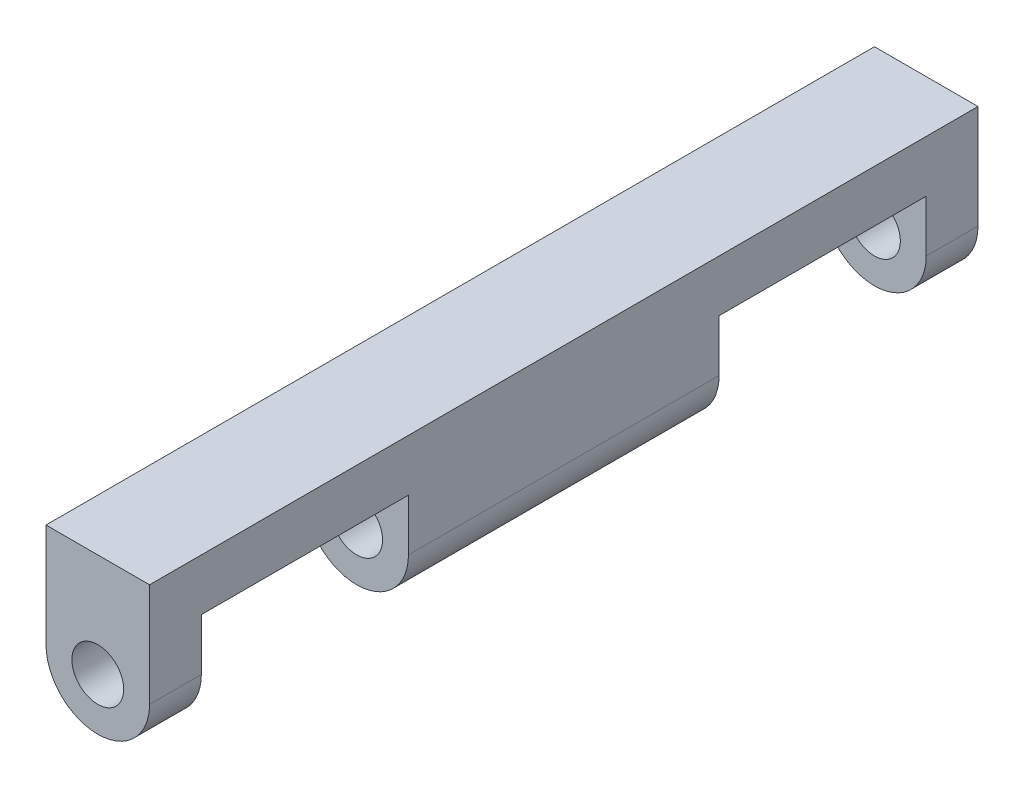
ISO-10303-21;
HEADER;
FILE_DESCRIPTION(('STEP AP214'),'2;1');
FILE_NAME('part.step','',(''),(''),'','','');
FILE_SCHEMA(('AUTOMOTIVE_DESIGN { 1 0 10303 214 1 1 1 1 }'));
ENDSEC;
DATA;
#1=APPLICATION_CONTEXT('core data for automotive mechanical design processes');
#2=APPLICATION_PROTOCOL_DEFINITION('international standard','automotive_design',2000,#1);
#3=PRODUCT_CONTEXT('',#1,'mechanical');
#4=PRODUCT('Part','Part','',(#3));
#5=PRODUCT_RELATED_PRODUCT_CATEGORY('part','',(#4));
#6=PRODUCT_DEFINITION_FORMATION('','',#4);
#7=PRODUCT_DEFINITION_CONTEXT('part definition',#1,'design');
#8=PRODUCT_DEFINITION('design','',#6,#7);
#9=PRODUCT_DEFINITION_SHAPE('','',#8);
#10=(LENGTH_UNIT() NAMED_UNIT(*) SI_UNIT(.MILLI.,.METRE.));
#11=(NAMED_UNIT(*) PLANE_ANGLE_UNIT() SI_UNIT($,.RADIAN.));
#12=(NAMED_UNIT(*) SI_UNIT($,.STERADIAN.) SOLID_ANGLE_UNIT());
#13=UNCERTAINTY_MEASURE_WITH_UNIT(LENGTH_MEASURE(1.E-05),#10,'distance_accuracy_value','');
#14=(GEOMETRIC_REPRESENTATION_CONTEXT(3) GLOBAL_UNCERTAINTY_ASSIGNED_CONTEXT((#13)) GLOBAL_UNIT_ASSIGNED_CONTEXT((#10,
#11,#12)) REPRESENTATION_CONTEXT('',''));
#15=CARTESIAN_POINT('',(0.,0.,0.));
#16=DIRECTION('',(0.,0.,1.));
#17=DIRECTION('',(1.,0.,0.));
#18=AXIS2_PLACEMENT_3D('',#15,#16,#17);
#19=CARTESIAN_POINT('',(0.,0.,80.));
#20=DIRECTION('',(0.,0.,-1.));
#21=DIRECTION('',(-1.,0.,0.));
#22=AXIS2_PLACEMENT_3D('',#19,#20,#21);
#23=CYLINDRICAL_SURFACE('',#22,5.);
#24=DIRECTION('',(0.,0.,-1.));
#25=VECTOR('',#24,1.);
#26=CARTESIAN_POINT('',(-5.,0.,80.));
#27=LINE('',#26,#25);
#28=CARTESIAN_POINT('',(-5.,0.,55.));
#29=VERTEX_POINT('',#28);
#30=CARTESIAN_POINT('',(-5.,0.,25.));
#31=VERTEX_POINT('',#30);
#32=EDGE_CURVE('E215',#29,#31,#27,.T.);
#33=ORIENTED_EDGE('',*,*,#32,.T.);
#34=CARTESIAN_POINT('',(0.,0.,25.));
#35=DIRECTION('',(0.,0.,1.));
#36=DIRECTION('',(0.,-1.,0.));
#37=AXIS2_PLACEMENT_3D('',#34,#35,#36);
#38=CIRCLE('',#37,5.);
#39=CARTESIAN_POINT('',(5.,0.,25.));
#40=VERTEX_POINT('',#39);
#41=EDGE_CURVE('E173',#31,#40,#38,.T.);
#42=ORIENTED_EDGE('',*,*,#41,.T.);
#43=DIRECTION('',(0.,0.,-1.));
#44=VECTOR('',#43,1.);
#45=CARTESIAN_POINT('',(5.,0.,80.));
#46=LINE('',#45,#44);
#47=CARTESIAN_POINT('',(5.,0.,55.));
#48=VERTEX_POINT('',#47);
#49=EDGE_CURVE('E210',#48,#40,#46,.T.);
#50=ORIENTED_EDGE('',*,*,#49,.F.);
#51=CARTESIAN_POINT('',(0.,0.,55.));
#52=DIRECTION('',(0.,0.,-1.));
#53=DIRECTION('',(-1.,0.,0.));
#54=AXIS2_PLACEMENT_3D('',#51,#52,#53);
#55=CIRCLE('',#54,5.);
#56=EDGE_CURVE('E159',#48,#29,#55,.T.);
#57=ORIENTED_EDGE('',*,*,#56,.T.);
#58=EDGE_LOOP('',(#33,#42,#50,#57));
#59=FACE_BOUND('',#58,.T.);
#60=ADVANCED_FACE('F34',(#59),#23,.T.);
#61=CARTESIAN_POINT('',(-5.,0.,80.));
#62=VERTEX_POINT('',#61);
#63=CARTESIAN_POINT('',(-5.,0.,75.));
#64=VERTEX_POINT('',#63);
#65=EDGE_CURVE('E211',#62,#64,#27,.T.);
#66=ORIENTED_EDGE('',*,*,#65,.T.);
#67=CARTESIAN_POINT('',(0.,0.,75.));
#68=DIRECTION('',(0.,0.,1.));
#69=DIRECTION('',(1.,0.,0.));
#70=AXIS2_PLACEMENT_3D('',#67,#68,#69);
#71=CIRCLE('',#70,5.);
#72=CARTESIAN_POINT('',(5.,0.,75.));
#73=VERTEX_POINT('',#72);
#74=EDGE_CURVE('E163',#64,#73,#71,.T.);
#75=ORIENTED_EDGE('',*,*,#74,.T.);
#76=CARTESIAN_POINT('',(5.,0.,80.));
#77=VERTEX_POINT('',#76);
#78=EDGE_CURVE('E206',#77,#73,#46,.T.);
#79=ORIENTED_EDGE('',*,*,#78,.F.);
#80=CARTESIAN_POINT('',(0.,0.,80.));
#81=DIRECTION('',(0.,0.,1.));
#82=DIRECTION('',(1.,0.,0.));
#83=AXIS2_PLACEMENT_3D('',#80,#81,#82);
#84=CIRCLE('',#83,5.);
#85=EDGE_CURVE('E194',#62,#77,#84,.T.);
#86=ORIENTED_EDGE('',*,*,#85,.F.);
#87=EDGE_LOOP('',(#66,#75,#79,#86));
#88=FACE_BOUND('',#87,.T.);
#89=ADVANCED_FACE('F246',(#88),#23,.T.);
#90=CARTESIAN_POINT('',(0.,0.,80.));
#91=DIRECTION('',(0.,0.,-1.));
#92=DIRECTION('',(-1.,0.,0.));
#93=AXIS2_PLACEMENT_3D('',#90,#91,#92);
#94=CYLINDRICAL_SURFACE('',#93,2.5);
#95=CARTESIAN_POINT('',(0.,0.,75.));
#96=DIRECTION('',(0.,0.,1.));
#97=DIRECTION('',(1.,0.,0.));
#98=AXIS2_PLACEMENT_3D('',#95,#96,#97);
#99=CIRCLE('',#98,2.5);
#100=CARTESIAN_POINT('',(2.5,0.,75.));
#101=VERTEX_POINT('',#100);
#102=EDGE_CURVE('E162',#101,#101,#99,.T.);
#103=ORIENTED_EDGE('',*,*,#102,.F.);
#104=EDGE_LOOP('',(#103));
#105=FACE_BOUND('',#104,.T.);
#106=CARTESIAN_POINT('',(0.,0.,80.));
#107=DIRECTION('',(0.,0.,1.));
#108=DIRECTION('',(1.,0.,0.));
#109=AXIS2_PLACEMENT_3D('',#106,#107,#108);
#110=CIRCLE('',#109,2.5);
#111=CARTESIAN_POINT('',(2.5,0.,80.));
#112=VERTEX_POINT('',#111);
#113=EDGE_CURVE('E180',#112,#112,#110,.T.);
#114=ORIENTED_EDGE('',*,*,#113,.T.);
#115=EDGE_LOOP('',(#114));
#116=FACE_BOUND('',#115,.T.);
#117=ADVANCED_FACE('F286',(#105,#116),#94,.F.);
#118=CARTESIAN_POINT('',(0.,0.,80.));
#119=DIRECTION('',(0.,0.,1.));
#120=DIRECTION('',(1.,0.,0.));
#121=AXIS2_PLACEMENT_3D('',#118,#119,#120);
#122=PLANE('',#121);
#123=DIRECTION('',(0.,1.,0.));
#124=VECTOR('',#123,1.);
#125=CARTESIAN_POINT('',(5.,10.,80.));
#126=LINE('',#125,#124);
#127=CARTESIAN_POINT('',(5.,10.,80.));
#128=VERTEX_POINT('',#127);
#129=EDGE_CURVE('E186',#77,#128,#126,.T.);
#130=ORIENTED_EDGE('',*,*,#129,.T.);
#131=DIRECTION('',(-1.,0.,0.));
#132=VECTOR('',#131,1.);
#133=CARTESIAN_POINT('',(-5.,10.,80.));
#134=LINE('',#133,#132);
#135=CARTESIAN_POINT('',(-5.,10.,80.));
#136=VERTEX_POINT('',#135);
#137=EDGE_CURVE('E189',#128,#136,#134,.T.);
#138=ORIENTED_EDGE('',*,*,#137,.T.);
#139=DIRECTION('',(0.,-1.,0.));
#140=VECTOR('',#139,1.);
#141=CARTESIAN_POINT('',(-5.,10.,80.));
#142=LINE('',#141,#140);
#143=EDGE_CURVE('E192',#136,#62,#142,.T.);
#144=ORIENTED_EDGE('',*,*,#143,.T.);
#145=ORIENTED_EDGE('',*,*,#85,.T.);
#146=EDGE_LOOP('',(#130,#138,#144,#145));
#147=FACE_BOUND('',#146,.T.);
#148=ORIENTED_EDGE('',*,*,#113,.F.);
#149=EDGE_LOOP('',(#148));
#150=FACE_BOUND('',#149,.T.);
#151=ADVANCED_FACE('F252',(#147,#150),#122,.T.);
#152=CARTESIAN_POINT('',(0.,0.,0.));
#153=DIRECTION('',(0.,0.,1.));
#154=DIRECTION('',(1.,0.,0.));
#155=AXIS2_PLACEMENT_3D('',#152,#153,#154);
#156=PLANE('',#155);
#157=DIRECTION('',(0.,1.,0.));
#158=VECTOR('',#157,1.);
#159=CARTESIAN_POINT('',(5.,10.,0.));
#160=LINE('',#159,#158);
#161=CARTESIAN_POINT('',(5.,0.,0.));
#162=VERTEX_POINT('',#161);
#163=CARTESIAN_POINT('',(5.,10.,0.));
#164=VERTEX_POINT('',#163);
#165=EDGE_CURVE('E183',#162,#164,#160,.T.);
#166=ORIENTED_EDGE('',*,*,#165,.F.);
#167=CARTESIAN_POINT('',(0.,0.,0.));
#168=DIRECTION('',(0.,0.,1.));
#169=DIRECTION('',(1.,0.,0.));
#170=AXIS2_PLACEMENT_3D('',#167,#168,#169);
#171=CIRCLE('',#170,5.);
#172=CARTESIAN_POINT('',(-5.,0.,0.));
#173=VERTEX_POINT('',#172);
#174=EDGE_CURVE('E190',#173,#162,#171,.T.);
#175=ORIENTED_EDGE('',*,*,#174,.F.);
#176=DIRECTION('',(0.,-1.,0.));
#177=VECTOR('',#176,1.);
#178=CARTESIAN_POINT('',(-5.,10.,0.));
#179=LINE('',#178,#177);
#180=CARTESIAN_POINT('',(-5.,10.,0.));
#181=VERTEX_POINT('',#180);
#182=EDGE_CURVE('E201',#181,#173,#179,.T.);
#183=ORIENTED_EDGE('',*,*,#182,.F.);
#184=DIRECTION('',(-1.,0.,0.));
#185=VECTOR('',#184,1.);
#186=CARTESIAN_POINT('',(-5.,10.,0.));
#187=LINE('',#186,#185);
#188=EDGE_CURVE('E199',#164,#181,#187,.T.);
#189=ORIENTED_EDGE('',*,*,#188,.F.);
#190=EDGE_LOOP('',(#166,#175,#183,#189));
#191=FACE_BOUND('',#190,.T.);
#192=CARTESIAN_POINT('',(0.,0.,0.));
#193=DIRECTION('',(0.,0.,1.));
#194=DIRECTION('',(1.,0.,0.));
#195=AXIS2_PLACEMENT_3D('',#192,#193,#194);
#196=CIRCLE('',#195,2.5);
#197=CARTESIAN_POINT('',(2.5,0.,0.));
#198=VERTEX_POINT('',#197);
#199=EDGE_CURVE('E179',#198,#198,#196,.T.);
#200=ORIENTED_EDGE('',*,*,#199,.T.);
#201=EDGE_LOOP('',(#200));
#202=FACE_BOUND('',#201,.T.);
#203=ADVANCED_FACE('F259',(#191,#202),#156,.F.);
#204=CARTESIAN_POINT('',(5.,10.,80.));
#205=DIRECTION('',(-1.,0.,0.));
#206=DIRECTION('',(0.,-1.,0.));
#207=AXIS2_PLACEMENT_3D('',#204,#205,#206);
#208=PLANE('',#207);
#209=ORIENTED_EDGE('',*,*,#49,.T.);
#210=DIRECTION('',(0.,-1.,0.));
#211=VECTOR('',#210,1.);
#212=CARTESIAN_POINT('',(5.,5.,25.));
#213=LINE('',#212,#211);
#214=CARTESIAN_POINT('',(5.,5.,25.));
#215=VERTEX_POINT('',#214);
#216=EDGE_CURVE('E139',#215,#40,#213,.T.);
#217=ORIENTED_EDGE('',*,*,#216,.F.);
#218=DIRECTION('',(0.,0.,1.));
#219=VECTOR('',#218,1.);
#220=CARTESIAN_POINT('',(5.,5.,25.));
#221=LINE('',#220,#219);
#222=CARTESIAN_POINT('',(5.,5.,5.));
#223=VERTEX_POINT('',#222);
#224=EDGE_CURVE('E129',#223,#215,#221,.T.);
#225=ORIENTED_EDGE('',*,*,#224,.F.);
#226=DIRECTION('',(0.,1.,0.));
#227=VECTOR('',#226,1.);
#228=CARTESIAN_POINT('',(5.,5.,5.));
#229=LINE('',#228,#227);
#230=CARTESIAN_POINT('',(5.,0.,5.));
#231=VERTEX_POINT('',#230);
#232=EDGE_CURVE('E134',#231,#223,#229,.T.);
#233=ORIENTED_EDGE('',*,*,#232,.F.);
#234=EDGE_CURVE('E196',#231,#162,#46,.T.);
#235=ORIENTED_EDGE('',*,*,#234,.T.);
#236=ORIENTED_EDGE('',*,*,#165,.T.);
#237=DIRECTION('',(0.,0.,-1.));
#238=VECTOR('',#237,1.);
#239=CARTESIAN_POINT('',(5.,10.,80.));
#240=LINE('',#239,#238);
#241=EDGE_CURVE('E218',#128,#164,#240,.T.);
#242=ORIENTED_EDGE('',*,*,#241,.F.);
#243=ORIENTED_EDGE('',*,*,#129,.F.);
#244=ORIENTED_EDGE('',*,*,#78,.T.);
#245=DIRECTION('',(0.,-1.,0.));
#246=VECTOR('',#245,1.);
#247=CARTESIAN_POINT('',(5.,5.,75.));
#248=LINE('',#247,#246);
#249=CARTESIAN_POINT('',(5.,5.,75.));
#250=VERTEX_POINT('',#249);
#251=EDGE_CURVE('E147',#250,#73,#248,.T.);
#252=ORIENTED_EDGE('',*,*,#251,.F.);
#253=DIRECTION('',(0.,0.,1.));
#254=VECTOR('',#253,1.);
#255=CARTESIAN_POINT('',(5.,5.,75.));
#256=LINE('',#255,#254);
#257=CARTESIAN_POINT('',(5.,5.,55.));
#258=VERTEX_POINT('',#257);
#259=EDGE_CURVE('E152',#258,#250,#256,.T.);
#260=ORIENTED_EDGE('',*,*,#259,.F.);
#261=DIRECTION('',(0.,1.,0.));
#262=VECTOR('',#261,1.);
#263=CARTESIAN_POINT('',(5.,5.,55.));
#264=LINE('',#263,#262);
#265=EDGE_CURVE('E149',#48,#258,#264,.T.);
#266=ORIENTED_EDGE('',*,*,#265,.F.);
#267=EDGE_LOOP('',(#209,#217,#225,#233,#235,#236,#242,#243,#244,#252,#260,#266));
#268=FACE_BOUND('',#267,.T.);
#269=ADVANCED_FACE('F36',(#268),#208,.F.);
#270=CARTESIAN_POINT('',(-5.,10.,80.));
#271=DIRECTION('',(0.,-1.,0.));
#272=DIRECTION('',(0.,0.,-1.));
#273=AXIS2_PLACEMENT_3D('',#270,#271,#272);
#274=PLANE('',#273);
#275=ORIENTED_EDGE('',*,*,#188,.T.);
#276=DIRECTION('',(0.,0.,-1.));
#277=VECTOR('',#276,1.);
#278=CARTESIAN_POINT('',(-5.,10.,80.));
#279=LINE('',#278,#277);
#280=EDGE_CURVE('E214',#136,#181,#279,.T.);
#281=ORIENTED_EDGE('',*,*,#280,.F.);
#282=ORIENTED_EDGE('',*,*,#137,.F.);
#283=ORIENTED_EDGE('',*,*,#241,.T.);
#284=EDGE_LOOP('',(#275,#281,#282,#283));
#285=FACE_BOUND('',#284,.T.);
#286=ADVANCED_FACE('F256',(#285),#274,.F.);
#287=CARTESIAN_POINT('',(-5.,10.,80.));
#288=DIRECTION('',(1.,0.,0.));
#289=DIRECTION('',(0.,1.,0.));
#290=AXIS2_PLACEMENT_3D('',#287,#288,#289);
#291=PLANE('',#290);
#292=DIRECTION('',(0.,0.,1.));
#293=VECTOR('',#292,1.);
#294=CARTESIAN_POINT('',(-5.,5.,80.));
#295=LINE('',#294,#293);
#296=CARTESIAN_POINT('',(-5.,5.,5.));
#297=VERTEX_POINT('',#296);
#298=CARTESIAN_POINT('',(-5.,5.,25.));
#299=VERTEX_POINT('',#298);
#300=EDGE_CURVE('E11',#297,#299,#295,.T.);
#301=ORIENTED_EDGE('',*,*,#300,.T.);
#302=DIRECTION('',(0.,-1.,0.));
#303=VECTOR('',#302,1.);
#304=CARTESIAN_POINT('',(-5.,9.99999999999999,25.));
#305=LINE('',#304,#303);
#306=EDGE_CURVE('E176',#299,#31,#305,.T.);
#307=ORIENTED_EDGE('',*,*,#306,.T.);
#308=ORIENTED_EDGE('',*,*,#32,.F.);
#309=DIRECTION('',(0.,1.,0.));
#310=VECTOR('',#309,1.);
#311=CARTESIAN_POINT('',(-5.,10.,55.));
#312=LINE('',#311,#310);
#313=CARTESIAN_POINT('',(-5.,5.,55.));
#314=VERTEX_POINT('',#313);
#315=EDGE_CURVE('E57',#29,#314,#312,.T.);
#316=ORIENTED_EDGE('',*,*,#315,.T.);
#317=DIRECTION('',(0.,0.,1.));
#318=VECTOR('',#317,1.);
#319=CARTESIAN_POINT('',(-5.,5.,80.));
#320=LINE('',#319,#318);
#321=CARTESIAN_POINT('',(-5.,5.,75.));
#322=VERTEX_POINT('',#321);
#323=EDGE_CURVE('E42',#314,#322,#320,.T.);
#324=ORIENTED_EDGE('',*,*,#323,.T.);
#325=DIRECTION('',(0.,-1.,0.));
#326=VECTOR('',#325,1.);
#327=CARTESIAN_POINT('',(-5.,10.,75.));
#328=LINE('',#327,#326);
#329=EDGE_CURVE('E166',#322,#64,#328,.T.);
#330=ORIENTED_EDGE('',*,*,#329,.T.);
#331=ORIENTED_EDGE('',*,*,#65,.F.);
#332=ORIENTED_EDGE('',*,*,#143,.F.);
#333=ORIENTED_EDGE('',*,*,#280,.T.);
#334=ORIENTED_EDGE('',*,*,#182,.T.);
#335=CARTESIAN_POINT('',(-5.,0.,5.));
#336=VERTEX_POINT('',#335);
#337=EDGE_CURVE('E209',#336,#173,#27,.T.);
#338=ORIENTED_EDGE('',*,*,#337,.F.);
#339=DIRECTION('',(0.,1.,0.));
#340=VECTOR('',#339,1.);
#341=CARTESIAN_POINT('',(-5.,10.,5.));
#342=LINE('',#341,#340);
#343=EDGE_CURVE('E49',#336,#297,#342,.T.);
#344=ORIENTED_EDGE('',*,*,#343,.T.);
#345=EDGE_LOOP('',(#301,#307,#308,#316,#324,#330,#331,#332,#333,#334,#338,#344));
#346=FACE_BOUND('',#345,.T.);
#347=ADVANCED_FACE('F230',(#346),#291,.F.);
#348=ORIENTED_EDGE('',*,*,#234,.F.);
#349=CARTESIAN_POINT('',(0.,0.,5.));
#350=DIRECTION('',(0.,0.,-1.));
#351=DIRECTION('',(0.,1.,0.));
#352=AXIS2_PLACEMENT_3D('',#349,#350,#351);
#353=CIRCLE('',#352,5.);
#354=EDGE_CURVE('E136',#231,#336,#353,.T.);
#355=ORIENTED_EDGE('',*,*,#354,.T.);
#356=ORIENTED_EDGE('',*,*,#337,.T.);
#357=ORIENTED_EDGE('',*,*,#174,.T.);
#358=EDGE_LOOP('',(#348,#355,#356,#357));
#359=FACE_BOUND('',#358,.T.);
#360=ADVANCED_FACE('F282',(#359),#23,.T.);
#361=CARTESIAN_POINT('',(0.,0.,5.));
#362=DIRECTION('',(0.,0.,-1.));
#363=DIRECTION('',(0.,1.,0.));
#364=AXIS2_PLACEMENT_3D('',#361,#362,#363);
#365=CIRCLE('',#364,2.5);
#366=CARTESIAN_POINT('',(0.,2.5,5.00000000000001));
#367=VERTEX_POINT('',#366);
#368=EDGE_CURVE('E169',#367,#367,#365,.T.);
#369=ORIENTED_EDGE('',*,*,#368,.F.);
#370=EDGE_LOOP('',(#369));
#371=FACE_BOUND('',#370,.T.);
#372=ORIENTED_EDGE('',*,*,#199,.F.);
#373=EDGE_LOOP('',(#372));
#374=FACE_BOUND('',#373,.T.);
#375=ADVANCED_FACE('F290',(#371,#374),#94,.F.);
#376=CARTESIAN_POINT('',(-75.,4.99999999999999,75.));
#377=DIRECTION('',(0.,1.,0.));
#378=DIRECTION('',(-1.,0.,0.));
#379=AXIS2_PLACEMENT_3D('',#376,#377,#378);
#380=PLANE('',#379);
#381=DIRECTION('',(1.,0.,0.));
#382=VECTOR('',#381,1.);
#383=CARTESIAN_POINT('',(-75.,4.99999999999999,55.));
#384=LINE('',#383,#382);
#385=EDGE_CURVE('E155',#314,#258,#384,.T.);
#386=ORIENTED_EDGE('',*,*,#385,.T.);
#387=ORIENTED_EDGE('',*,*,#259,.T.);
#388=DIRECTION('',(1.,0.,0.));
#389=VECTOR('',#388,1.);
#390=CARTESIAN_POINT('',(-75.,4.99999999999999,75.));
#391=LINE('',#390,#389);
#392=EDGE_CURVE('E156',#322,#250,#391,.T.);
#393=ORIENTED_EDGE('',*,*,#392,.F.);
#394=ORIENTED_EDGE('',*,*,#323,.F.);
#395=EDGE_LOOP('',(#386,#387,#393,#394));
#396=FACE_BOUND('',#395,.T.);
#397=ADVANCED_FACE('F235',(#396),#380,.F.);
#398=CARTESIAN_POINT('',(-75.,4.99999999999999,75.));
#399=DIRECTION('',(0.,0.,1.));
#400=DIRECTION('',(1.,0.,0.));
#401=AXIS2_PLACEMENT_3D('',#398,#399,#400);
#402=PLANE('',#401);
#403=ORIENTED_EDGE('',*,*,#102,.T.);
#404=EDGE_LOOP('',(#403));
#405=FACE_BOUND('',#404,.T.);
#406=ORIENTED_EDGE('',*,*,#392,.T.);
#407=ORIENTED_EDGE('',*,*,#251,.T.);
#408=ORIENTED_EDGE('',*,*,#74,.F.);
#409=ORIENTED_EDGE('',*,*,#329,.F.);
#410=EDGE_LOOP('',(#406,#407,#408,#409));
#411=FACE_BOUND('',#410,.T.);
#412=ADVANCED_FACE('F244',(#405,#411),#402,.F.);
#413=CARTESIAN_POINT('',(-75.,4.99999999999999,55.));
#414=DIRECTION('',(0.,0.,-1.));
#415=DIRECTION('',(-1.,0.,0.));
#416=AXIS2_PLACEMENT_3D('',#413,#414,#415);
#417=PLANE('',#416);
#418=CARTESIAN_POINT('',(0.,0.,55.));
#419=DIRECTION('',(0.,0.,-1.));
#420=DIRECTION('',(-1.,0.,0.));
#421=AXIS2_PLACEMENT_3D('',#418,#419,#420);
#422=CIRCLE('',#421,2.5);
#423=CARTESIAN_POINT('',(-2.5,0.,55.));
#424=VERTEX_POINT('',#423);
#425=EDGE_CURVE('E145',#424,#424,#422,.T.);
#426=ORIENTED_EDGE('',*,*,#425,.T.);
#427=EDGE_LOOP('',(#426));
#428=FACE_BOUND('',#427,.T.);
#429=ORIENTED_EDGE('',*,*,#56,.F.);
#430=ORIENTED_EDGE('',*,*,#265,.T.);
#431=ORIENTED_EDGE('',*,*,#385,.F.);
#432=ORIENTED_EDGE('',*,*,#315,.F.);
#433=EDGE_LOOP('',(#429,#430,#431,#432));
#434=FACE_BOUND('',#433,.T.);
#435=ADVANCED_FACE('F236',(#428,#434),#417,.F.);
#436=CARTESIAN_POINT('',(-75.,4.99999999999999,25.));
#437=DIRECTION('',(0.,1.,0.));
#438=DIRECTION('',(-1.,0.,0.));
#439=AXIS2_PLACEMENT_3D('',#436,#437,#438);
#440=PLANE('',#439);
#441=DIRECTION('',(1.,0.,0.));
#442=VECTOR('',#441,1.);
#443=CARTESIAN_POINT('',(-75.,4.99999999999999,5.));
#444=LINE('',#443,#442);
#445=EDGE_CURVE('E124',#297,#223,#444,.T.);
#446=ORIENTED_EDGE('',*,*,#445,.T.);
#447=ORIENTED_EDGE('',*,*,#224,.T.);
#448=DIRECTION('',(1.,0.,0.));
#449=VECTOR('',#448,1.);
#450=CARTESIAN_POINT('',(-75.,4.99999999999999,25.));
#451=LINE('',#450,#449);
#452=EDGE_CURVE('E131',#299,#215,#451,.T.);
#453=ORIENTED_EDGE('',*,*,#452,.F.);
#454=ORIENTED_EDGE('',*,*,#300,.F.);
#455=EDGE_LOOP('',(#446,#447,#453,#454));
#456=FACE_BOUND('',#455,.T.);
#457=ADVANCED_FACE('F126',(#456),#440,.F.);
#458=CARTESIAN_POINT('',(-75.,4.99999999999999,25.));
#459=DIRECTION('',(0.,0.,1.));
#460=DIRECTION('',(0.,-1.,0.));
#461=AXIS2_PLACEMENT_3D('',#458,#459,#460);
#462=PLANE('',#461);
#463=CARTESIAN_POINT('',(0.,0.,25.));
#464=DIRECTION('',(0.,0.,1.));
#465=DIRECTION('',(0.,-1.,0.));
#466=AXIS2_PLACEMENT_3D('',#463,#464,#465);
#467=CIRCLE('',#466,2.5);
#468=CARTESIAN_POINT('',(0.,-2.5,25.));
#469=VERTEX_POINT('',#468);
#470=EDGE_CURVE('E172',#469,#469,#467,.T.);
#471=ORIENTED_EDGE('',*,*,#470,.T.);
#472=EDGE_LOOP('',(#471));
#473=FACE_BOUND('',#472,.T.);
#474=ORIENTED_EDGE('',*,*,#452,.T.);
#475=ORIENTED_EDGE('',*,*,#216,.T.);
#476=ORIENTED_EDGE('',*,*,#41,.F.);
#477=ORIENTED_EDGE('',*,*,#306,.F.);
#478=EDGE_LOOP('',(#474,#475,#476,#477));
#479=FACE_BOUND('',#478,.T.);
#480=ADVANCED_FACE('F267',(#473,#479),#462,.F.);
#481=CARTESIAN_POINT('',(-75.,4.99999999999999,5.));
#482=DIRECTION('',(0.,0.,-1.));
#483=DIRECTION('',(0.,1.,0.));
#484=AXIS2_PLACEMENT_3D('',#481,#482,#483);
#485=PLANE('',#484);
#486=ORIENTED_EDGE('',*,*,#368,.T.);
#487=EDGE_LOOP('',(#486));
#488=FACE_BOUND('',#487,.T.);
#489=ORIENTED_EDGE('',*,*,#354,.F.);
#490=ORIENTED_EDGE('',*,*,#232,.T.);
#491=ORIENTED_EDGE('',*,*,#445,.F.);
#492=ORIENTED_EDGE('',*,*,#343,.F.);
#493=EDGE_LOOP('',(#489,#490,#491,#492));
#494=FACE_BOUND('',#493,.T.);
#495=ADVANCED_FACE('F135',(#488,#494),#485,.F.);
#496=ORIENTED_EDGE('',*,*,#470,.F.);
#497=EDGE_LOOP('',(#496));
#498=FACE_BOUND('',#497,.T.);
#499=ORIENTED_EDGE('',*,*,#425,.F.);
#500=EDGE_LOOP('',(#499));
#501=FACE_BOUND('',#500,.T.);
#502=ADVANCED_FACE('F275',(#498,#501),#94,.F.);
#503=CLOSED_SHELL('',(#60,#89,#117,#151,#203,#269,#286,#347,#360,#375,#397,#412,#435,#457,#480,
#495,#502));
#504=MANIFOLD_SOLID_BREP('B2',#503);
#505=ADVANCED_BREP_SHAPE_REPRESENTATION('',(#18,#504),#14);
#506=SHAPE_DEFINITION_REPRESENTATION(#9,#505);
ENDSEC;
END-ISO-10303-21;
